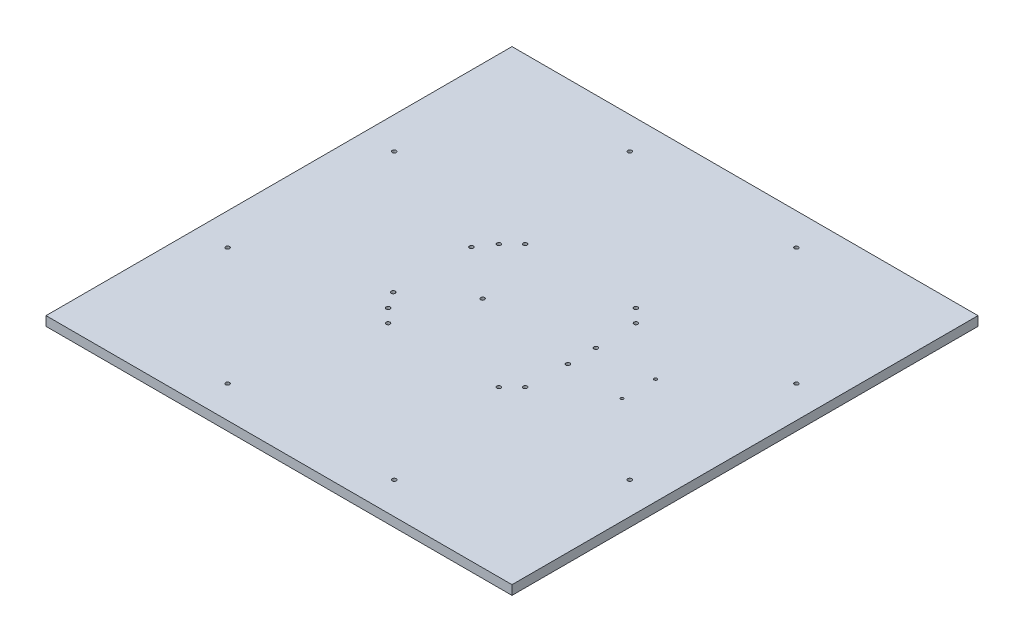
ISO-10303-21;
HEADER;
FILE_DESCRIPTION(('STEP AP214'),'2;1');
FILE_NAME('part.step','',(''),(''),'','','');
FILE_SCHEMA(('AUTOMOTIVE_DESIGN { 1 0 10303 214 1 1 1 1 }'));
ENDSEC;
DATA;
#1=APPLICATION_CONTEXT('core data for automotive mechanical design processes');
#2=APPLICATION_PROTOCOL_DEFINITION('international standard','automotive_design',2000,#1);
#3=PRODUCT_CONTEXT('',#1,'mechanical');
#4=PRODUCT('Part','Part','',(#3));
#5=PRODUCT_RELATED_PRODUCT_CATEGORY('part','',(#4));
#6=PRODUCT_DEFINITION_FORMATION('','',#4);
#7=PRODUCT_DEFINITION_CONTEXT('part definition',#1,'design');
#8=PRODUCT_DEFINITION('design','',#6,#7);
#9=PRODUCT_DEFINITION_SHAPE('','',#8);
#10=(LENGTH_UNIT() NAMED_UNIT(*) SI_UNIT(.MILLI.,.METRE.));
#11=(NAMED_UNIT(*) PLANE_ANGLE_UNIT() SI_UNIT($,.RADIAN.));
#12=(NAMED_UNIT(*) SI_UNIT($,.STERADIAN.) SOLID_ANGLE_UNIT());
#13=UNCERTAINTY_MEASURE_WITH_UNIT(LENGTH_MEASURE(1.E-05),#10,'distance_accuracy_value','');
#14=(GEOMETRIC_REPRESENTATION_CONTEXT(3) GLOBAL_UNCERTAINTY_ASSIGNED_CONTEXT((#13)) GLOBAL_UNIT_ASSIGNED_CONTEXT((#10,
#11,#12)) REPRESENTATION_CONTEXT('',''));
#15=CARTESIAN_POINT('',(0.,0.,0.));
#16=DIRECTION('',(0.,0.,1.));
#17=DIRECTION('',(1.,0.,0.));
#18=AXIS2_PLACEMENT_3D('',#15,#16,#17);
#19=CARTESIAN_POINT('',(250.,10.,-250.));
#20=DIRECTION('',(-1.,0.,0.));
#21=DIRECTION('',(0.,0.,1.));
#22=AXIS2_PLACEMENT_3D('',#19,#20,#21);
#23=PLANE('',#22);
#24=DIRECTION('',(0.,0.,-1.));
#25=VECTOR('',#24,1.);
#26=CARTESIAN_POINT('',(250.,0.,-250.));
#27=LINE('',#26,#25);
#28=CARTESIAN_POINT('',(250.,0.,250.));
#29=VERTEX_POINT('',#28);
#30=CARTESIAN_POINT('',(250.,0.,-250.));
#31=VERTEX_POINT('',#30);
#32=EDGE_CURVE('E97',#29,#31,#27,.T.);
#33=ORIENTED_EDGE('',*,*,#32,.T.);
#34=DIRECTION('',(0.,-1.,0.));
#35=VECTOR('',#34,1.);
#36=CARTESIAN_POINT('',(250.,10.,-250.));
#37=LINE('',#36,#35);
#38=CARTESIAN_POINT('',(250.,10.,-250.));
#39=VERTEX_POINT('',#38);
#40=EDGE_CURVE('E11',#39,#31,#37,.T.);
#41=ORIENTED_EDGE('',*,*,#40,.F.);
#42=DIRECTION('',(0.,0.,-1.));
#43=VECTOR('',#42,1.);
#44=CARTESIAN_POINT('',(250.,10.,-250.));
#45=LINE('',#44,#43);
#46=CARTESIAN_POINT('',(250.,10.,250.));
#47=VERTEX_POINT('',#46);
#48=EDGE_CURVE('E85',#47,#39,#45,.T.);
#49=ORIENTED_EDGE('',*,*,#48,.F.);
#50=DIRECTION('',(0.,-1.,0.));
#51=VECTOR('',#50,1.);
#52=CARTESIAN_POINT('',(250.,10.,250.));
#53=LINE('',#52,#51);
#54=EDGE_CURVE('E93',#47,#29,#53,.T.);
#55=ORIENTED_EDGE('',*,*,#54,.T.);
#56=EDGE_LOOP('',(#33,#41,#49,#55));
#57=FACE_BOUND('',#56,.T.);
#58=ADVANCED_FACE('F34',(#57),#23,.F.);
#59=CARTESIAN_POINT('',(-250.,10.,-250.));
#60=DIRECTION('',(0.,0.,1.));
#61=DIRECTION('',(1.,0.,0.));
#62=AXIS2_PLACEMENT_3D('',#59,#60,#61);
#63=PLANE('',#62);
#64=DIRECTION('',(-1.,0.,0.));
#65=VECTOR('',#64,1.);
#66=CARTESIAN_POINT('',(-250.,0.,-250.));
#67=LINE('',#66,#65);
#68=CARTESIAN_POINT('',(-250.,0.,-250.));
#69=VERTEX_POINT('',#68);
#70=EDGE_CURVE('E89',#31,#69,#67,.T.);
#71=ORIENTED_EDGE('',*,*,#70,.T.);
#72=DIRECTION('',(0.,-1.,0.));
#73=VECTOR('',#72,1.);
#74=CARTESIAN_POINT('',(-250.,10.,-250.));
#75=LINE('',#74,#73);
#76=CARTESIAN_POINT('',(-250.,10.,-250.));
#77=VERTEX_POINT('',#76);
#78=EDGE_CURVE('E42',#77,#69,#75,.T.);
#79=ORIENTED_EDGE('',*,*,#78,.F.);
#80=DIRECTION('',(-1.,0.,0.));
#81=VECTOR('',#80,1.);
#82=CARTESIAN_POINT('',(-250.,10.,-250.));
#83=LINE('',#82,#81);
#84=EDGE_CURVE('E80',#39,#77,#83,.T.);
#85=ORIENTED_EDGE('',*,*,#84,.F.);
#86=ORIENTED_EDGE('',*,*,#40,.T.);
#87=EDGE_LOOP('',(#71,#79,#85,#86));
#88=FACE_BOUND('',#87,.T.);
#89=ADVANCED_FACE('F88',(#88),#63,.F.);
#90=CARTESIAN_POINT('',(-250.,10.,-250.));
#91=DIRECTION('',(1.,0.,0.));
#92=DIRECTION('',(0.,0.,-1.));
#93=AXIS2_PLACEMENT_3D('',#90,#91,#92);
#94=PLANE('',#93);
#95=DIRECTION('',(0.,0.,1.));
#96=VECTOR('',#95,1.);
#97=CARTESIAN_POINT('',(-250.,0.,-250.));
#98=LINE('',#97,#96);
#99=CARTESIAN_POINT('',(-250.,0.,250.));
#100=VERTEX_POINT('',#99);
#101=EDGE_CURVE('E67',#69,#100,#98,.T.);
#102=ORIENTED_EDGE('',*,*,#101,.T.);
#103=DIRECTION('',(0.,-1.,0.));
#104=VECTOR('',#103,1.);
#105=CARTESIAN_POINT('',(-250.,10.,250.));
#106=LINE('',#105,#104);
#107=CARTESIAN_POINT('',(-250.,10.,250.));
#108=VERTEX_POINT('',#107);
#109=EDGE_CURVE('E90',#108,#100,#106,.T.);
#110=ORIENTED_EDGE('',*,*,#109,.F.);
#111=DIRECTION('',(0.,0.,1.));
#112=VECTOR('',#111,1.);
#113=CARTESIAN_POINT('',(-250.,10.,-250.));
#114=LINE('',#113,#112);
#115=EDGE_CURVE('E83',#77,#108,#114,.T.);
#116=ORIENTED_EDGE('',*,*,#115,.F.);
#117=ORIENTED_EDGE('',*,*,#78,.T.);
#118=EDGE_LOOP('',(#102,#110,#116,#117));
#119=FACE_BOUND('',#118,.T.);
#120=ADVANCED_FACE('F91',(#119),#94,.F.);
#121=CARTESIAN_POINT('',(-250.,10.,250.));
#122=DIRECTION('',(0.,0.,-1.));
#123=DIRECTION('',(-1.,0.,0.));
#124=AXIS2_PLACEMENT_3D('',#121,#122,#123);
#125=PLANE('',#124);
#126=DIRECTION('',(1.,0.,0.));
#127=VECTOR('',#126,1.);
#128=CARTESIAN_POINT('',(-250.,0.,250.));
#129=LINE('',#128,#127);
#130=EDGE_CURVE('E73',#100,#29,#129,.T.);
#131=ORIENTED_EDGE('',*,*,#130,.T.);
#132=ORIENTED_EDGE('',*,*,#54,.F.);
#133=DIRECTION('',(1.,0.,0.));
#134=VECTOR('',#133,1.);
#135=CARTESIAN_POINT('',(-250.,10.,250.));
#136=LINE('',#135,#134);
#137=EDGE_CURVE('E50',#108,#47,#136,.T.);
#138=ORIENTED_EDGE('',*,*,#137,.F.);
#139=ORIENTED_EDGE('',*,*,#109,.T.);
#140=EDGE_LOOP('',(#131,#132,#138,#139));
#141=FACE_BOUND('',#140,.T.);
#142=ADVANCED_FACE('F105',(#141),#125,.F.);
#143=CARTESIAN_POINT('',(0.,10.,0.));
#144=DIRECTION('',(0.,1.,0.));
#145=DIRECTION('',(0.,0.,1.));
#146=AXIS2_PLACEMENT_3D('',#143,#144,#145);
#147=PLANE('',#146);
#148=CARTESIAN_POINT('',(75.,10.,-15.));
#149=DIRECTION('',(0.,1.,0.));
#150=DIRECTION('',(0.,0.,1.));
#151=AXIS2_PLACEMENT_3D('',#148,#149,#150);
#152=CIRCLE('',#151,2.1);
#153=CARTESIAN_POINT('',(75.,10.,-12.9));
#154=VERTEX_POINT('',#153);
#155=EDGE_CURVE('E243',#154,#154,#152,.T.);
#156=ORIENTED_EDGE('',*,*,#155,.F.);
#157=EDGE_LOOP('',(#156));
#158=FACE_BOUND('',#157,.T.);
#159=CARTESIAN_POINT('',(75.,10.,15.));
#160=DIRECTION('',(0.,1.,0.));
#161=DIRECTION('',(0.,0.,1.));
#162=AXIS2_PLACEMENT_3D('',#159,#160,#161);
#163=CIRCLE('',#162,2.1);
#164=CARTESIAN_POINT('',(75.,10.,17.1));
#165=VERTEX_POINT('',#164);
#166=EDGE_CURVE('E237',#165,#165,#163,.T.);
#167=ORIENTED_EDGE('',*,*,#166,.F.);
#168=EDGE_LOOP('',(#167));
#169=FACE_BOUND('',#168,.T.);
#170=CARTESIAN_POINT('',(136.,10.,-18.));
#171=DIRECTION('',(0.,-1.,0.));
#172=DIRECTION('',(0.,0.,-1.));
#173=AXIS2_PLACEMENT_3D('',#170,#171,#172);
#174=CIRCLE('',#173,1.59999999999999);
#175=CARTESIAN_POINT('',(136.,10.,-19.6));
#176=VERTEX_POINT('',#175);
#177=EDGE_CURVE('E211',#176,#176,#174,.T.);
#178=ORIENTED_EDGE('',*,*,#177,.T.);
#179=EDGE_LOOP('',(#178));
#180=FACE_BOUND('',#179,.T.);
#181=CARTESIAN_POINT('',(136.,10.,18.));
#182=DIRECTION('',(0.,-1.,0.));
#183=DIRECTION('',(0.,0.,-1.));
#184=AXIS2_PLACEMENT_3D('',#181,#182,#183);
#185=CIRCLE('',#184,1.59999999999999);
#186=CARTESIAN_POINT('',(136.,10.,16.4));
#187=VERTEX_POINT('',#186);
#188=EDGE_CURVE('E228',#187,#187,#185,.T.);
#189=ORIENTED_EDGE('',*,*,#188,.T.);
#190=EDGE_LOOP('',(#189));
#191=FACE_BOUND('',#190,.T.);
#192=CARTESIAN_POINT('',(-85.5000000000002,10.,-42.));
#193=DIRECTION('',(0.,1.,0.));
#194=DIRECTION('',(0.,0.,1.));
#195=AXIS2_PLACEMENT_3D('',#192,#193,#194);
#196=CIRCLE('',#195,2.1);
#197=CARTESIAN_POINT('',(-85.5000000000002,10.,-39.9));
#198=VERTEX_POINT('',#197);
#199=EDGE_CURVE('E175',#198,#198,#196,.T.);
#200=ORIENTED_EDGE('',*,*,#199,.F.);
#201=EDGE_LOOP('',(#200));
#202=FACE_BOUND('',#201,.T.);
#203=CARTESIAN_POINT('',(-85.5000000000002,10.,42.));
#204=DIRECTION('',(0.,1.,0.));
#205=DIRECTION('',(0.,0.,1.));
#206=AXIS2_PLACEMENT_3D('',#203,#204,#205);
#207=CIRCLE('',#206,2.1);
#208=CARTESIAN_POINT('',(-85.5000000000002,10.,44.1));
#209=VERTEX_POINT('',#208);
#210=EDGE_CURVE('E217',#209,#209,#207,.T.);
#211=ORIENTED_EDGE('',*,*,#210,.F.);
#212=EDGE_LOOP('',(#211));
#213=FACE_BOUND('',#212,.T.);
#214=CARTESIAN_POINT('',(-31.5000000000002,10.,0.));
#215=DIRECTION('',(0.,1.,0.));
#216=DIRECTION('',(0.,0.,1.));
#217=AXIS2_PLACEMENT_3D('',#214,#215,#216);
#218=CIRCLE('',#217,2.1);
#219=CARTESIAN_POINT('',(-31.5000000000002,10.,2.10000000000001));
#220=VERTEX_POINT('',#219);
#221=EDGE_CURVE('E210',#220,#220,#218,.T.);
#222=ORIENTED_EDGE('',*,*,#221,.F.);
#223=EDGE_LOOP('',(#222));
#224=FACE_BOUND('',#223,.T.);
#225=CARTESIAN_POINT('',(-59.3969696196704,10.,-73.5391052434006));
#226=DIRECTION('',(0.,1.,0.));
#227=DIRECTION('',(1.,0.,0.));
#228=AXIS2_PLACEMENT_3D('',#225,#226,#227);
#229=CIRCLE('',#228,2.1);
#230=CARTESIAN_POINT('',(-57.2969696196704,10.,-73.5391052434006));
#231=VERTEX_POINT('',#230);
#232=EDGE_CURVE('E163',#231,#231,#229,.T.);
#233=ORIENTED_EDGE('',*,*,#232,.F.);
#234=EDGE_LOOP('',(#233));
#235=FACE_BOUND('',#234,.T.);
#236=CARTESIAN_POINT('',(-73.5391052434013,10.,-59.3969696196696));
#237=DIRECTION('',(0.,1.,0.));
#238=DIRECTION('',(1.,0.,0.));
#239=AXIS2_PLACEMENT_3D('',#236,#237,#238);
#240=CIRCLE('',#239,2.1);
#241=CARTESIAN_POINT('',(-71.4391052434013,10.,-59.3969696196696));
#242=VERTEX_POINT('',#241);
#243=EDGE_CURVE('E199',#242,#242,#240,.T.);
#244=ORIENTED_EDGE('',*,*,#243,.F.);
#245=EDGE_LOOP('',(#244));
#246=FACE_BOUND('',#245,.T.);
#247=CARTESIAN_POINT('',(-73.5391052434008,10.,59.3969696196701));
#248=DIRECTION('',(0.,1.,0.));
#249=DIRECTION('',(0.,0.,-1.));
#250=AXIS2_PLACEMENT_3D('',#247,#248,#249);
#251=CIRCLE('',#250,2.1);
#252=CARTESIAN_POINT('',(-73.5391052434008,10.,57.2969696196701));
#253=VERTEX_POINT('',#252);
#254=EDGE_CURVE('E193',#253,#253,#251,.T.);
#255=ORIENTED_EDGE('',*,*,#254,.F.);
#256=EDGE_LOOP('',(#255));
#257=FACE_BOUND('',#256,.T.);
#258=CARTESIAN_POINT('',(-59.3969696196699,10.,73.5391052434011));
#259=DIRECTION('',(0.,1.,0.));
#260=DIRECTION('',(0.,0.,-1.));
#261=AXIS2_PLACEMENT_3D('',#258,#259,#260);
#262=CIRCLE('',#261,2.1);
#263=CARTESIAN_POINT('',(-59.3969696196699,10.,71.4391052434011));
#264=VERTEX_POINT('',#263);
#265=EDGE_CURVE('E187',#264,#264,#262,.T.);
#266=ORIENTED_EDGE('',*,*,#265,.F.);
#267=EDGE_LOOP('',(#266));
#268=FACE_BOUND('',#267,.T.);
#269=CARTESIAN_POINT('',(59.3969696196709,10.,73.5391052434002));
#270=DIRECTION('',(0.,1.,0.));
#271=DIRECTION('',(-1.,0.,0.));
#272=AXIS2_PLACEMENT_3D('',#269,#270,#271);
#273=CIRCLE('',#272,2.1);
#274=CARTESIAN_POINT('',(57.2969696196709,10.,73.5391052434002));
#275=VERTEX_POINT('',#274);
#276=EDGE_CURVE('E181',#275,#275,#273,.T.);
#277=ORIENTED_EDGE('',*,*,#276,.F.);
#278=EDGE_LOOP('',(#277));
#279=FACE_BOUND('',#278,.T.);
#280=CARTESIAN_POINT('',(73.5391052434017,10.,59.3969696196691));
#281=DIRECTION('',(0.,1.,0.));
#282=DIRECTION('',(-1.,0.,0.));
#283=AXIS2_PLACEMENT_3D('',#280,#281,#282);
#284=CIRCLE('',#283,2.1);
#285=CARTESIAN_POINT('',(71.4391052434017,10.,59.3969696196691));
#286=VERTEX_POINT('',#285);
#287=EDGE_CURVE('E174',#286,#286,#284,.T.);
#288=ORIENTED_EDGE('',*,*,#287,.F.);
#289=EDGE_LOOP('',(#288));
#290=FACE_BOUND('',#289,.T.);
#291=CARTESIAN_POINT('',(73.5391052434008,10.,-59.3969696196701));
#292=DIRECTION('',(0.,1.,0.));
#293=DIRECTION('',(0.,0.,1.));
#294=AXIS2_PLACEMENT_3D('',#291,#292,#293);
#295=CIRCLE('',#294,2.1);
#296=CARTESIAN_POINT('',(73.5391052434008,10.,-57.2969696196701));
#297=VERTEX_POINT('',#296);
#298=EDGE_CURVE('E121',#297,#297,#295,.T.);
#299=ORIENTED_EDGE('',*,*,#298,.F.);
#300=EDGE_LOOP('',(#299));
#301=FACE_BOUND('',#300,.T.);
#302=CARTESIAN_POINT('',(59.3969696196699,10.,-73.5391052434011));
#303=DIRECTION('',(0.,1.,0.));
#304=DIRECTION('',(0.,0.,1.));
#305=AXIS2_PLACEMENT_3D('',#302,#303,#304);
#306=CIRCLE('',#305,2.1);
#307=CARTESIAN_POINT('',(59.3969696196699,10.,-71.4391052434011));
#308=VERTEX_POINT('',#307);
#309=EDGE_CURVE('E162',#308,#308,#306,.T.);
#310=ORIENTED_EDGE('',*,*,#309,.F.);
#311=EDGE_LOOP('',(#310));
#312=FACE_BOUND('',#311,.T.);
#313=CARTESIAN_POINT('',(-89.3565814572487,10.,-215.725870841385));
#314=DIRECTION('',(0.,1.,0.));
#315=DIRECTION('',(0.707106781186549,0.,0.707106781186546));
#316=AXIS2_PLACEMENT_3D('',#313,#314,#315);
#317=CIRCLE('',#316,2.1);
#318=CARTESIAN_POINT('',(-87.8716572167569,10.,-214.240946600894));
#319=VERTEX_POINT('',#318);
#320=EDGE_CURVE('E114',#319,#319,#317,.T.);
#321=ORIENTED_EDGE('',*,*,#320,.F.);
#322=EDGE_LOOP('',(#321));
#323=FACE_BOUND('',#322,.T.);
#324=CARTESIAN_POINT('',(-215.725870841386,10.,-89.3565814572479));
#325=DIRECTION('',(0.,1.,0.));
#326=DIRECTION('',(1.,0.,0.));
#327=AXIS2_PLACEMENT_3D('',#324,#325,#326);
#328=CIRCLE('',#327,2.1);
#329=CARTESIAN_POINT('',(-213.625870841386,10.,-89.3565814572479));
#330=VERTEX_POINT('',#329);
#331=EDGE_CURVE('E151',#330,#330,#328,.T.);
#332=ORIENTED_EDGE('',*,*,#331,.F.);
#333=EDGE_LOOP('',(#332));
#334=FACE_BOUND('',#333,.T.);
#335=CARTESIAN_POINT('',(-215.725870841385,10.,89.3565814572494));
#336=DIRECTION('',(0.,1.,0.));
#337=DIRECTION('',(0.707106781186544,0.,-0.707106781186551));
#338=AXIS2_PLACEMENT_3D('',#335,#336,#337);
#339=CIRCLE('',#338,2.1);
#340=CARTESIAN_POINT('',(-214.240946600893,10.,87.8716572167577));
#341=VERTEX_POINT('',#340);
#342=EDGE_CURVE('E145',#341,#341,#339,.T.);
#343=ORIENTED_EDGE('',*,*,#342,.F.);
#344=EDGE_LOOP('',(#343));
#345=FACE_BOUND('',#344,.T.);
#346=CARTESIAN_POINT('',(-89.3565814572487,10.,215.725870841385));
#347=DIRECTION('',(0.,1.,0.));
#348=DIRECTION('',(0.,0.,-1.));
#349=AXIS2_PLACEMENT_3D('',#346,#347,#348);
#350=CIRCLE('',#349,2.1);
#351=CARTESIAN_POINT('',(-89.3565814572487,10.,213.625870841385));
#352=VERTEX_POINT('',#351);
#353=EDGE_CURVE('E139',#352,#352,#350,.T.);
#354=ORIENTED_EDGE('',*,*,#353,.F.);
#355=EDGE_LOOP('',(#354));
#356=FACE_BOUND('',#355,.T.);
#357=CARTESIAN_POINT('',(89.3565814572502,10.,215.725870841385));
#358=DIRECTION('',(0.,1.,0.));
#359=DIRECTION('',(-0.707106781186554,0.,-0.707106781186541));
#360=AXIS2_PLACEMENT_3D('',#357,#358,#359);
#361=CIRCLE('',#360,2.1);
#362=CARTESIAN_POINT('',(87.8716572167584,10.,214.240946600893));
#363=VERTEX_POINT('',#362);
#364=EDGE_CURVE('E133',#363,#363,#361,.T.);
#365=ORIENTED_EDGE('',*,*,#364,.F.);
#366=EDGE_LOOP('',(#365));
#367=FACE_BOUND('',#366,.T.);
#368=CARTESIAN_POINT('',(215.725870841386,10.,89.3565814572464));
#369=DIRECTION('',(0.,1.,0.));
#370=DIRECTION('',(-1.,0.,0.));
#371=AXIS2_PLACEMENT_3D('',#368,#369,#370);
#372=CIRCLE('',#371,2.1);
#373=CARTESIAN_POINT('',(213.625870841386,10.,89.3565814572464));
#374=VERTEX_POINT('',#373);
#375=EDGE_CURVE('E127',#374,#374,#372,.T.);
#376=ORIENTED_EDGE('',*,*,#375,.F.);
#377=EDGE_LOOP('',(#376));
#378=FACE_BOUND('',#377,.T.);
#379=CARTESIAN_POINT('',(215.725870841384,10.,-89.3565814572509));
#380=DIRECTION('',(0.,1.,0.));
#381=DIRECTION('',(-0.707106781186539,0.,0.707106781186556));
#382=AXIS2_PLACEMENT_3D('',#379,#380,#381);
#383=CIRCLE('',#382,2.1);
#384=CARTESIAN_POINT('',(214.240946600893,10.,-87.8716572167591));
#385=VERTEX_POINT('',#384);
#386=EDGE_CURVE('E120',#385,#385,#383,.T.);
#387=ORIENTED_EDGE('',*,*,#386,.F.);
#388=EDGE_LOOP('',(#387));
#389=FACE_BOUND('',#388,.T.);
#390=CARTESIAN_POINT('',(89.3565814572487,10.,-215.725870841385));
#391=DIRECTION('',(0.,1.,0.));
#392=DIRECTION('',(0.,0.,1.));
#393=AXIS2_PLACEMENT_3D('',#390,#391,#392);
#394=CIRCLE('',#393,2.1);
#395=CARTESIAN_POINT('',(89.3565814572487,10.,-213.625870841385));
#396=VERTEX_POINT('',#395);
#397=EDGE_CURVE('E100',#396,#396,#394,.T.);
#398=ORIENTED_EDGE('',*,*,#397,.F.);
#399=EDGE_LOOP('',(#398));
#400=FACE_BOUND('',#399,.T.);
#401=ORIENTED_EDGE('',*,*,#48,.T.);
#402=ORIENTED_EDGE('',*,*,#84,.T.);
#403=ORIENTED_EDGE('',*,*,#115,.T.);
#404=ORIENTED_EDGE('',*,*,#137,.T.);
#405=EDGE_LOOP('',(#401,#402,#403,#404));
#406=FACE_BOUND('',#405,.T.);
#407=ADVANCED_FACE('F81',(#158,#169,#180,#191,#202,#213,#224,#235,#246,#257,#268,#279,#290,#301,
#312,#323,#334,#345,#356,#367,#378,#389,#400,#406),#147,.T.);
#408=CARTESIAN_POINT('',(0.,0.,0.));
#409=DIRECTION('',(0.,1.,0.));
#410=DIRECTION('',(0.,0.,1.));
#411=AXIS2_PLACEMENT_3D('',#408,#409,#410);
#412=PLANE('',#411);
#413=CARTESIAN_POINT('',(75.,0.,-15.));
#414=DIRECTION('',(0.,1.,0.));
#415=DIRECTION('',(0.,0.,1.));
#416=AXIS2_PLACEMENT_3D('',#413,#414,#415);
#417=CIRCLE('',#416,2.1);
#418=CARTESIAN_POINT('',(75.,0.,-12.9));
#419=VERTEX_POINT('',#418);
#420=EDGE_CURVE('E229',#419,#419,#417,.T.);
#421=ORIENTED_EDGE('',*,*,#420,.T.);
#422=EDGE_LOOP('',(#421));
#423=FACE_BOUND('',#422,.T.);
#424=CARTESIAN_POINT('',(75.,0.,15.));
#425=DIRECTION('',(0.,1.,0.));
#426=DIRECTION('',(0.,0.,1.));
#427=AXIS2_PLACEMENT_3D('',#424,#425,#426);
#428=CIRCLE('',#427,2.1);
#429=CARTESIAN_POINT('',(75.,0.,17.1));
#430=VERTEX_POINT('',#429);
#431=EDGE_CURVE('E240',#430,#430,#428,.T.);
#432=ORIENTED_EDGE('',*,*,#431,.T.);
#433=EDGE_LOOP('',(#432));
#434=FACE_BOUND('',#433,.T.);
#435=CARTESIAN_POINT('',(136.,0.,-18.));
#436=DIRECTION('',(0.,-1.,0.));
#437=DIRECTION('',(0.,0.,-1.));
#438=AXIS2_PLACEMENT_3D('',#435,#436,#437);
#439=CIRCLE('',#438,1.59999999999999);
#440=CARTESIAN_POINT('',(136.,0.,-19.6));
#441=VERTEX_POINT('',#440);
#442=EDGE_CURVE('E232',#441,#441,#439,.T.);
#443=ORIENTED_EDGE('',*,*,#442,.F.);
#444=EDGE_LOOP('',(#443));
#445=FACE_BOUND('',#444,.T.);
#446=CARTESIAN_POINT('',(136.,0.,18.));
#447=DIRECTION('',(0.,-1.,0.));
#448=DIRECTION('',(0.,0.,-1.));
#449=AXIS2_PLACEMENT_3D('',#446,#447,#448);
#450=CIRCLE('',#449,1.59999999999999);
#451=CARTESIAN_POINT('',(136.,0.,16.4));
#452=VERTEX_POINT('',#451);
#453=EDGE_CURVE('E225',#452,#452,#450,.T.);
#454=ORIENTED_EDGE('',*,*,#453,.F.);
#455=EDGE_LOOP('',(#454));
#456=FACE_BOUND('',#455,.T.);
#457=CARTESIAN_POINT('',(-85.5000000000002,0.,-42.));
#458=DIRECTION('',(0.,1.,0.));
#459=DIRECTION('',(0.,0.,1.));
#460=AXIS2_PLACEMENT_3D('',#457,#458,#459);
#461=CIRCLE('',#460,2.1);
#462=CARTESIAN_POINT('',(-85.5000000000002,0.,-39.9));
#463=VERTEX_POINT('',#462);
#464=EDGE_CURVE('E220',#463,#463,#461,.T.);
#465=ORIENTED_EDGE('',*,*,#464,.T.);
#466=EDGE_LOOP('',(#465));
#467=FACE_BOUND('',#466,.T.);
#468=CARTESIAN_POINT('',(-85.5000000000002,0.,42.));
#469=DIRECTION('',(0.,1.,0.));
#470=DIRECTION('',(0.,0.,1.));
#471=AXIS2_PLACEMENT_3D('',#468,#469,#470);
#472=CIRCLE('',#471,2.1);
#473=CARTESIAN_POINT('',(-85.5000000000002,0.,44.1));
#474=VERTEX_POINT('',#473);
#475=EDGE_CURVE('E214',#474,#474,#472,.T.);
#476=ORIENTED_EDGE('',*,*,#475,.T.);
#477=EDGE_LOOP('',(#476));
#478=FACE_BOUND('',#477,.T.);
#479=CARTESIAN_POINT('',(-31.5000000000002,0.,0.));
#480=DIRECTION('',(0.,1.,0.));
#481=DIRECTION('',(0.,0.,1.));
#482=AXIS2_PLACEMENT_3D('',#479,#480,#481);
#483=CIRCLE('',#482,2.1);
#484=CARTESIAN_POINT('',(-31.5000000000002,0.,2.10000000000001));
#485=VERTEX_POINT('',#484);
#486=EDGE_CURVE('E207',#485,#485,#483,.T.);
#487=ORIENTED_EDGE('',*,*,#486,.T.);
#488=EDGE_LOOP('',(#487));
#489=FACE_BOUND('',#488,.T.);
#490=CARTESIAN_POINT('',(-59.3969696196704,0.,-73.5391052434006));
#491=DIRECTION('',(0.,1.,0.));
#492=DIRECTION('',(1.,0.,0.));
#493=AXIS2_PLACEMENT_3D('',#490,#491,#492);
#494=CIRCLE('',#493,2.1);
#495=CARTESIAN_POINT('',(-57.2969696196704,0.,-73.5391052434006));
#496=VERTEX_POINT('',#495);
#497=EDGE_CURVE('E202',#496,#496,#494,.T.);
#498=ORIENTED_EDGE('',*,*,#497,.T.);
#499=EDGE_LOOP('',(#498));
#500=FACE_BOUND('',#499,.T.);
#501=CARTESIAN_POINT('',(-73.5391052434013,0.,-59.3969696196696));
#502=DIRECTION('',(0.,1.,0.));
#503=DIRECTION('',(1.,0.,0.));
#504=AXIS2_PLACEMENT_3D('',#501,#502,#503);
#505=CIRCLE('',#504,2.1);
#506=CARTESIAN_POINT('',(-71.4391052434013,0.,-59.3969696196696));
#507=VERTEX_POINT('',#506);
#508=EDGE_CURVE('E196',#507,#507,#505,.T.);
#509=ORIENTED_EDGE('',*,*,#508,.T.);
#510=EDGE_LOOP('',(#509));
#511=FACE_BOUND('',#510,.T.);
#512=CARTESIAN_POINT('',(-73.5391052434008,0.,59.3969696196701));
#513=DIRECTION('',(0.,1.,0.));
#514=DIRECTION('',(0.,0.,-1.));
#515=AXIS2_PLACEMENT_3D('',#512,#513,#514);
#516=CIRCLE('',#515,2.1);
#517=CARTESIAN_POINT('',(-73.5391052434008,0.,57.2969696196701));
#518=VERTEX_POINT('',#517);
#519=EDGE_CURVE('E190',#518,#518,#516,.T.);
#520=ORIENTED_EDGE('',*,*,#519,.T.);
#521=EDGE_LOOP('',(#520));
#522=FACE_BOUND('',#521,.T.);
#523=CARTESIAN_POINT('',(-59.3969696196699,0.,73.5391052434011));
#524=DIRECTION('',(0.,1.,0.));
#525=DIRECTION('',(0.,0.,-1.));
#526=AXIS2_PLACEMENT_3D('',#523,#524,#525);
#527=CIRCLE('',#526,2.1);
#528=CARTESIAN_POINT('',(-59.3969696196699,0.,71.4391052434011));
#529=VERTEX_POINT('',#528);
#530=EDGE_CURVE('E184',#529,#529,#527,.T.);
#531=ORIENTED_EDGE('',*,*,#530,.T.);
#532=EDGE_LOOP('',(#531));
#533=FACE_BOUND('',#532,.T.);
#534=CARTESIAN_POINT('',(59.3969696196709,0.,73.5391052434002));
#535=DIRECTION('',(0.,1.,0.));
#536=DIRECTION('',(-1.,0.,0.));
#537=AXIS2_PLACEMENT_3D('',#534,#535,#536);
#538=CIRCLE('',#537,2.1);
#539=CARTESIAN_POINT('',(57.2969696196709,0.,73.5391052434002));
#540=VERTEX_POINT('',#539);
#541=EDGE_CURVE('E178',#540,#540,#538,.T.);
#542=ORIENTED_EDGE('',*,*,#541,.T.);
#543=EDGE_LOOP('',(#542));
#544=FACE_BOUND('',#543,.T.);
#545=CARTESIAN_POINT('',(73.5391052434017,0.,59.3969696196691));
#546=DIRECTION('',(0.,1.,0.));
#547=DIRECTION('',(-1.,0.,0.));
#548=AXIS2_PLACEMENT_3D('',#545,#546,#547);
#549=CIRCLE('',#548,2.1);
#550=CARTESIAN_POINT('',(71.4391052434017,0.,59.3969696196691));
#551=VERTEX_POINT('',#550);
#552=EDGE_CURVE('E171',#551,#551,#549,.T.);
#553=ORIENTED_EDGE('',*,*,#552,.T.);
#554=EDGE_LOOP('',(#553));
#555=FACE_BOUND('',#554,.T.);
#556=CARTESIAN_POINT('',(73.5391052434008,0.,-59.3969696196701));
#557=DIRECTION('',(0.,1.,0.));
#558=DIRECTION('',(0.,0.,1.));
#559=AXIS2_PLACEMENT_3D('',#556,#557,#558);
#560=CIRCLE('',#559,2.1);
#561=CARTESIAN_POINT('',(73.5391052434008,0.,-57.2969696196701));
#562=VERTEX_POINT('',#561);
#563=EDGE_CURVE('E166',#562,#562,#560,.T.);
#564=ORIENTED_EDGE('',*,*,#563,.T.);
#565=EDGE_LOOP('',(#564));
#566=FACE_BOUND('',#565,.T.);
#567=CARTESIAN_POINT('',(59.3969696196699,0.,-73.5391052434011));
#568=DIRECTION('',(0.,1.,0.));
#569=DIRECTION('',(0.,0.,1.));
#570=AXIS2_PLACEMENT_3D('',#567,#568,#569);
#571=CIRCLE('',#570,2.1);
#572=CARTESIAN_POINT('',(59.3969696196699,0.,-71.4391052434011));
#573=VERTEX_POINT('',#572);
#574=EDGE_CURVE('E159',#573,#573,#571,.T.);
#575=ORIENTED_EDGE('',*,*,#574,.T.);
#576=EDGE_LOOP('',(#575));
#577=FACE_BOUND('',#576,.T.);
#578=CARTESIAN_POINT('',(-89.3565814572487,0.,-215.725870841385));
#579=DIRECTION('',(0.,1.,0.));
#580=DIRECTION('',(0.707106781186549,0.,0.707106781186546));
#581=AXIS2_PLACEMENT_3D('',#578,#579,#580);
#582=CIRCLE('',#581,2.1);
#583=CARTESIAN_POINT('',(-87.8716572167569,0.,-214.240946600894));
#584=VERTEX_POINT('',#583);
#585=EDGE_CURVE('E154',#584,#584,#582,.T.);
#586=ORIENTED_EDGE('',*,*,#585,.T.);
#587=EDGE_LOOP('',(#586));
#588=FACE_BOUND('',#587,.T.);
#589=CARTESIAN_POINT('',(-215.725870841386,0.,-89.3565814572479));
#590=DIRECTION('',(0.,1.,0.));
#591=DIRECTION('',(1.,0.,0.));
#592=AXIS2_PLACEMENT_3D('',#589,#590,#591);
#593=CIRCLE('',#592,2.1);
#594=CARTESIAN_POINT('',(-213.625870841386,0.,-89.3565814572479));
#595=VERTEX_POINT('',#594);
#596=EDGE_CURVE('E148',#595,#595,#593,.T.);
#597=ORIENTED_EDGE('',*,*,#596,.T.);
#598=EDGE_LOOP('',(#597));
#599=FACE_BOUND('',#598,.T.);
#600=CARTESIAN_POINT('',(-215.725870841385,0.,89.3565814572494));
#601=DIRECTION('',(0.,1.,0.));
#602=DIRECTION('',(0.707106781186544,0.,-0.707106781186551));
#603=AXIS2_PLACEMENT_3D('',#600,#601,#602);
#604=CIRCLE('',#603,2.1);
#605=CARTESIAN_POINT('',(-214.240946600893,0.,87.8716572167577));
#606=VERTEX_POINT('',#605);
#607=EDGE_CURVE('E142',#606,#606,#604,.T.);
#608=ORIENTED_EDGE('',*,*,#607,.T.);
#609=EDGE_LOOP('',(#608));
#610=FACE_BOUND('',#609,.T.);
#611=CARTESIAN_POINT('',(-89.3565814572487,0.,215.725870841385));
#612=DIRECTION('',(0.,1.,0.));
#613=DIRECTION('',(0.,0.,-1.));
#614=AXIS2_PLACEMENT_3D('',#611,#612,#613);
#615=CIRCLE('',#614,2.1);
#616=CARTESIAN_POINT('',(-89.3565814572487,0.,213.625870841385));
#617=VERTEX_POINT('',#616);
#618=EDGE_CURVE('E136',#617,#617,#615,.T.);
#619=ORIENTED_EDGE('',*,*,#618,.T.);
#620=EDGE_LOOP('',(#619));
#621=FACE_BOUND('',#620,.T.);
#622=CARTESIAN_POINT('',(89.3565814572502,0.,215.725870841385));
#623=DIRECTION('',(0.,1.,0.));
#624=DIRECTION('',(-0.707106781186554,0.,-0.707106781186541));
#625=AXIS2_PLACEMENT_3D('',#622,#623,#624);
#626=CIRCLE('',#625,2.1);
#627=CARTESIAN_POINT('',(87.8716572167584,0.,214.240946600893));
#628=VERTEX_POINT('',#627);
#629=EDGE_CURVE('E130',#628,#628,#626,.T.);
#630=ORIENTED_EDGE('',*,*,#629,.T.);
#631=EDGE_LOOP('',(#630));
#632=FACE_BOUND('',#631,.T.);
#633=CARTESIAN_POINT('',(215.725870841386,0.,89.3565814572464));
#634=DIRECTION('',(0.,1.,0.));
#635=DIRECTION('',(-1.,0.,0.));
#636=AXIS2_PLACEMENT_3D('',#633,#634,#635);
#637=CIRCLE('',#636,2.1);
#638=CARTESIAN_POINT('',(213.625870841386,0.,89.3565814572464));
#639=VERTEX_POINT('',#638);
#640=EDGE_CURVE('E124',#639,#639,#637,.T.);
#641=ORIENTED_EDGE('',*,*,#640,.T.);
#642=EDGE_LOOP('',(#641));
#643=FACE_BOUND('',#642,.T.);
#644=CARTESIAN_POINT('',(215.725870841384,0.,-89.3565814572509));
#645=DIRECTION('',(0.,1.,0.));
#646=DIRECTION('',(-0.707106781186539,0.,0.707106781186556));
#647=AXIS2_PLACEMENT_3D('',#644,#645,#646);
#648=CIRCLE('',#647,2.1);
#649=CARTESIAN_POINT('',(214.240946600893,0.,-87.8716572167591));
#650=VERTEX_POINT('',#649);
#651=EDGE_CURVE('E117',#650,#650,#648,.T.);
#652=ORIENTED_EDGE('',*,*,#651,.T.);
#653=EDGE_LOOP('',(#652));
#654=FACE_BOUND('',#653,.T.);
#655=CARTESIAN_POINT('',(89.3565814572487,0.,-215.725870841385));
#656=DIRECTION('',(0.,1.,0.));
#657=DIRECTION('',(0.,0.,1.));
#658=AXIS2_PLACEMENT_3D('',#655,#656,#657);
#659=CIRCLE('',#658,2.1);
#660=CARTESIAN_POINT('',(89.3565814572487,0.,-213.625870841385));
#661=VERTEX_POINT('',#660);
#662=EDGE_CURVE('E111',#661,#661,#659,.T.);
#663=ORIENTED_EDGE('',*,*,#662,.T.);
#664=EDGE_LOOP('',(#663));
#665=FACE_BOUND('',#664,.T.);
#666=ORIENTED_EDGE('',*,*,#32,.F.);
#667=ORIENTED_EDGE('',*,*,#130,.F.);
#668=ORIENTED_EDGE('',*,*,#101,.F.);
#669=ORIENTED_EDGE('',*,*,#70,.F.);
#670=EDGE_LOOP('',(#666,#667,#668,#669));
#671=FACE_BOUND('',#670,.T.);
#672=ADVANCED_FACE('F108',(#423,#434,#445,#456,#467,#478,#489,#500,#511,#522,#533,#544,#555,
#566,#577,#588,#599,#610,#621,#632,#643,#654,#665,#671),#412,.F.);
#673=CARTESIAN_POINT('',(89.3565814572487,10.,-215.725870841385));
#674=DIRECTION('',(0.,-1.,0.));
#675=DIRECTION('',(0.,0.,-1.));
#676=AXIS2_PLACEMENT_3D('',#673,#674,#675);
#677=CYLINDRICAL_SURFACE('',#676,2.1);
#678=ORIENTED_EDGE('',*,*,#397,.T.);
#679=EDGE_LOOP('',(#678));
#680=FACE_BOUND('',#679,.T.);
#681=ORIENTED_EDGE('',*,*,#662,.F.);
#682=EDGE_LOOP('',(#681));
#683=FACE_BOUND('',#682,.T.);
#684=ADVANCED_FACE('F305',(#680,#683),#677,.F.);
#685=CARTESIAN_POINT('',(215.725870841384,10.,-89.3565814572509));
#686=DIRECTION('',(0.,-1.,0.));
#687=DIRECTION('',(0.,0.,-1.));
#688=AXIS2_PLACEMENT_3D('',#685,#686,#687);
#689=CYLINDRICAL_SURFACE('',#688,2.1);
#690=ORIENTED_EDGE('',*,*,#386,.T.);
#691=EDGE_LOOP('',(#690));
#692=FACE_BOUND('',#691,.T.);
#693=ORIENTED_EDGE('',*,*,#651,.F.);
#694=EDGE_LOOP('',(#693));
#695=FACE_BOUND('',#694,.T.);
#696=ADVANCED_FACE('F308',(#692,#695),#689,.F.);
#697=CARTESIAN_POINT('',(215.725870841386,10.,89.3565814572464));
#698=DIRECTION('',(0.,-1.,0.));
#699=DIRECTION('',(0.,0.,-1.));
#700=AXIS2_PLACEMENT_3D('',#697,#698,#699);
#701=CYLINDRICAL_SURFACE('',#700,2.1);
#702=ORIENTED_EDGE('',*,*,#375,.T.);
#703=EDGE_LOOP('',(#702));
#704=FACE_BOUND('',#703,.T.);
#705=ORIENTED_EDGE('',*,*,#640,.F.);
#706=EDGE_LOOP('',(#705));
#707=FACE_BOUND('',#706,.T.);
#708=ADVANCED_FACE('F352',(#704,#707),#701,.F.);
#709=CARTESIAN_POINT('',(89.3565814572502,10.,215.725870841385));
#710=DIRECTION('',(0.,-1.,0.));
#711=DIRECTION('',(0.,0.,-1.));
#712=AXIS2_PLACEMENT_3D('',#709,#710,#711);
#713=CYLINDRICAL_SURFACE('',#712,2.1);
#714=ORIENTED_EDGE('',*,*,#364,.T.);
#715=EDGE_LOOP('',(#714));
#716=FACE_BOUND('',#715,.T.);
#717=ORIENTED_EDGE('',*,*,#629,.F.);
#718=EDGE_LOOP('',(#717));
#719=FACE_BOUND('',#718,.T.);
#720=ADVANCED_FACE('F360',(#716,#719),#713,.F.);
#721=CARTESIAN_POINT('',(-89.3565814572487,10.,215.725870841385));
#722=DIRECTION('',(0.,-1.,0.));
#723=DIRECTION('',(0.,0.,-1.));
#724=AXIS2_PLACEMENT_3D('',#721,#722,#723);
#725=CYLINDRICAL_SURFACE('',#724,2.1);
#726=ORIENTED_EDGE('',*,*,#353,.T.);
#727=EDGE_LOOP('',(#726));
#728=FACE_BOUND('',#727,.T.);
#729=ORIENTED_EDGE('',*,*,#618,.F.);
#730=EDGE_LOOP('',(#729));
#731=FACE_BOUND('',#730,.T.);
#732=ADVANCED_FACE('F368',(#728,#731),#725,.F.);
#733=CARTESIAN_POINT('',(-215.725870841385,10.,89.3565814572494));
#734=DIRECTION('',(0.,-1.,0.));
#735=DIRECTION('',(0.,0.,-1.));
#736=AXIS2_PLACEMENT_3D('',#733,#734,#735);
#737=CYLINDRICAL_SURFACE('',#736,2.1);
#738=ORIENTED_EDGE('',*,*,#342,.T.);
#739=EDGE_LOOP('',(#738));
#740=FACE_BOUND('',#739,.T.);
#741=ORIENTED_EDGE('',*,*,#607,.F.);
#742=EDGE_LOOP('',(#741));
#743=FACE_BOUND('',#742,.T.);
#744=ADVANCED_FACE('F376',(#740,#743),#737,.F.);
#745=CARTESIAN_POINT('',(-215.725870841386,10.,-89.3565814572479));
#746=DIRECTION('',(0.,-1.,0.));
#747=DIRECTION('',(0.,0.,-1.));
#748=AXIS2_PLACEMENT_3D('',#745,#746,#747);
#749=CYLINDRICAL_SURFACE('',#748,2.1);
#750=ORIENTED_EDGE('',*,*,#331,.T.);
#751=EDGE_LOOP('',(#750));
#752=FACE_BOUND('',#751,.T.);
#753=ORIENTED_EDGE('',*,*,#596,.F.);
#754=EDGE_LOOP('',(#753));
#755=FACE_BOUND('',#754,.T.);
#756=ADVANCED_FACE('F384',(#752,#755),#749,.F.);
#757=CARTESIAN_POINT('',(-89.3565814572487,10.,-215.725870841385));
#758=DIRECTION('',(0.,-1.,0.));
#759=DIRECTION('',(0.,0.,-1.));
#760=AXIS2_PLACEMENT_3D('',#757,#758,#759);
#761=CYLINDRICAL_SURFACE('',#760,2.1);
#762=ORIENTED_EDGE('',*,*,#320,.T.);
#763=EDGE_LOOP('',(#762));
#764=FACE_BOUND('',#763,.T.);
#765=ORIENTED_EDGE('',*,*,#585,.F.);
#766=EDGE_LOOP('',(#765));
#767=FACE_BOUND('',#766,.T.);
#768=ADVANCED_FACE('F392',(#764,#767),#761,.F.);
#769=CARTESIAN_POINT('',(59.3969696196699,10.,-73.5391052434011));
#770=DIRECTION('',(0.,-1.,0.));
#771=DIRECTION('',(0.,0.,-1.));
#772=AXIS2_PLACEMENT_3D('',#769,#770,#771);
#773=CYLINDRICAL_SURFACE('',#772,2.1);
#774=ORIENTED_EDGE('',*,*,#309,.T.);
#775=EDGE_LOOP('',(#774));
#776=FACE_BOUND('',#775,.T.);
#777=ORIENTED_EDGE('',*,*,#574,.F.);
#778=EDGE_LOOP('',(#777));
#779=FACE_BOUND('',#778,.T.);
#780=ADVANCED_FACE('F400',(#776,#779),#773,.F.);
#781=CARTESIAN_POINT('',(73.5391052434008,10.,-59.3969696196701));
#782=DIRECTION('',(0.,-1.,0.));
#783=DIRECTION('',(0.,0.,-1.));
#784=AXIS2_PLACEMENT_3D('',#781,#782,#783);
#785=CYLINDRICAL_SURFACE('',#784,2.1);
#786=ORIENTED_EDGE('',*,*,#298,.T.);
#787=EDGE_LOOP('',(#786));
#788=FACE_BOUND('',#787,.T.);
#789=ORIENTED_EDGE('',*,*,#563,.F.);
#790=EDGE_LOOP('',(#789));
#791=FACE_BOUND('',#790,.T.);
#792=ADVANCED_FACE('F408',(#788,#791),#785,.F.);
#793=CARTESIAN_POINT('',(73.5391052434017,10.,59.3969696196691));
#794=DIRECTION('',(0.,-1.,0.));
#795=DIRECTION('',(0.,0.,-1.));
#796=AXIS2_PLACEMENT_3D('',#793,#794,#795);
#797=CYLINDRICAL_SURFACE('',#796,2.1);
#798=ORIENTED_EDGE('',*,*,#287,.T.);
#799=EDGE_LOOP('',(#798));
#800=FACE_BOUND('',#799,.T.);
#801=ORIENTED_EDGE('',*,*,#552,.F.);
#802=EDGE_LOOP('',(#801));
#803=FACE_BOUND('',#802,.T.);
#804=ADVANCED_FACE('F416',(#800,#803),#797,.F.);
#805=CARTESIAN_POINT('',(59.3969696196709,10.,73.5391052434002));
#806=DIRECTION('',(0.,-1.,0.));
#807=DIRECTION('',(0.,0.,-1.));
#808=AXIS2_PLACEMENT_3D('',#805,#806,#807);
#809=CYLINDRICAL_SURFACE('',#808,2.1);
#810=ORIENTED_EDGE('',*,*,#276,.T.);
#811=EDGE_LOOP('',(#810));
#812=FACE_BOUND('',#811,.T.);
#813=ORIENTED_EDGE('',*,*,#541,.F.);
#814=EDGE_LOOP('',(#813));
#815=FACE_BOUND('',#814,.T.);
#816=ADVANCED_FACE('F424',(#812,#815),#809,.F.);
#817=CARTESIAN_POINT('',(-59.3969696196699,10.,73.5391052434011));
#818=DIRECTION('',(0.,-1.,0.));
#819=DIRECTION('',(0.,0.,-1.));
#820=AXIS2_PLACEMENT_3D('',#817,#818,#819);
#821=CYLINDRICAL_SURFACE('',#820,2.1);
#822=ORIENTED_EDGE('',*,*,#265,.T.);
#823=EDGE_LOOP('',(#822));
#824=FACE_BOUND('',#823,.T.);
#825=ORIENTED_EDGE('',*,*,#530,.F.);
#826=EDGE_LOOP('',(#825));
#827=FACE_BOUND('',#826,.T.);
#828=ADVANCED_FACE('F432',(#824,#827),#821,.F.);
#829=CARTESIAN_POINT('',(-73.5391052434008,10.,59.3969696196701));
#830=DIRECTION('',(0.,-1.,0.));
#831=DIRECTION('',(0.,0.,-1.));
#832=AXIS2_PLACEMENT_3D('',#829,#830,#831);
#833=CYLINDRICAL_SURFACE('',#832,2.1);
#834=ORIENTED_EDGE('',*,*,#254,.T.);
#835=EDGE_LOOP('',(#834));
#836=FACE_BOUND('',#835,.T.);
#837=ORIENTED_EDGE('',*,*,#519,.F.);
#838=EDGE_LOOP('',(#837));
#839=FACE_BOUND('',#838,.T.);
#840=ADVANCED_FACE('F440',(#836,#839),#833,.F.);
#841=CARTESIAN_POINT('',(-73.5391052434013,10.,-59.3969696196696));
#842=DIRECTION('',(0.,-1.,0.));
#843=DIRECTION('',(0.,0.,-1.));
#844=AXIS2_PLACEMENT_3D('',#841,#842,#843);
#845=CYLINDRICAL_SURFACE('',#844,2.1);
#846=ORIENTED_EDGE('',*,*,#243,.T.);
#847=EDGE_LOOP('',(#846));
#848=FACE_BOUND('',#847,.T.);
#849=ORIENTED_EDGE('',*,*,#508,.F.);
#850=EDGE_LOOP('',(#849));
#851=FACE_BOUND('',#850,.T.);
#852=ADVANCED_FACE('F448',(#848,#851),#845,.F.);
#853=CARTESIAN_POINT('',(-59.3969696196704,10.,-73.5391052434006));
#854=DIRECTION('',(0.,-1.,0.));
#855=DIRECTION('',(0.,0.,-1.));
#856=AXIS2_PLACEMENT_3D('',#853,#854,#855);
#857=CYLINDRICAL_SURFACE('',#856,2.1);
#858=ORIENTED_EDGE('',*,*,#232,.T.);
#859=EDGE_LOOP('',(#858));
#860=FACE_BOUND('',#859,.T.);
#861=ORIENTED_EDGE('',*,*,#497,.F.);
#862=EDGE_LOOP('',(#861));
#863=FACE_BOUND('',#862,.T.);
#864=ADVANCED_FACE('F456',(#860,#863),#857,.F.);
#865=CARTESIAN_POINT('',(-31.5000000000002,10.,0.));
#866=DIRECTION('',(0.,-1.,0.));
#867=DIRECTION('',(0.,0.,-1.));
#868=AXIS2_PLACEMENT_3D('',#865,#866,#867);
#869=CYLINDRICAL_SURFACE('',#868,2.1);
#870=ORIENTED_EDGE('',*,*,#221,.T.);
#871=EDGE_LOOP('',(#870));
#872=FACE_BOUND('',#871,.T.);
#873=ORIENTED_EDGE('',*,*,#486,.F.);
#874=EDGE_LOOP('',(#873));
#875=FACE_BOUND('',#874,.T.);
#876=ADVANCED_FACE('F464',(#872,#875),#869,.F.);
#877=CARTESIAN_POINT('',(-85.5000000000002,10.,42.));
#878=DIRECTION('',(0.,-1.,0.));
#879=DIRECTION('',(0.,0.,-1.));
#880=AXIS2_PLACEMENT_3D('',#877,#878,#879);
#881=CYLINDRICAL_SURFACE('',#880,2.1);
#882=ORIENTED_EDGE('',*,*,#210,.T.);
#883=EDGE_LOOP('',(#882));
#884=FACE_BOUND('',#883,.T.);
#885=ORIENTED_EDGE('',*,*,#475,.F.);
#886=EDGE_LOOP('',(#885));
#887=FACE_BOUND('',#886,.T.);
#888=ADVANCED_FACE('F472',(#884,#887),#881,.F.);
#889=CARTESIAN_POINT('',(-85.5000000000002,10.,-42.));
#890=DIRECTION('',(0.,-1.,0.));
#891=DIRECTION('',(0.,0.,-1.));
#892=AXIS2_PLACEMENT_3D('',#889,#890,#891);
#893=CYLINDRICAL_SURFACE('',#892,2.1);
#894=ORIENTED_EDGE('',*,*,#199,.T.);
#895=EDGE_LOOP('',(#894));
#896=FACE_BOUND('',#895,.T.);
#897=ORIENTED_EDGE('',*,*,#464,.F.);
#898=EDGE_LOOP('',(#897));
#899=FACE_BOUND('',#898,.T.);
#900=ADVANCED_FACE('F480',(#896,#899),#893,.F.);
#901=CARTESIAN_POINT('',(136.,10.,18.));
#902=DIRECTION('',(0.,-1.,0.));
#903=DIRECTION('',(0.,0.,-1.));
#904=AXIS2_PLACEMENT_3D('',#901,#902,#903);
#905=CYLINDRICAL_SURFACE('',#904,1.59999999999999);
#906=ORIENTED_EDGE('',*,*,#188,.F.);
#907=EDGE_LOOP('',(#906));
#908=FACE_BOUND('',#907,.T.);
#909=ORIENTED_EDGE('',*,*,#453,.T.);
#910=EDGE_LOOP('',(#909));
#911=FACE_BOUND('',#910,.T.);
#912=ADVANCED_FACE('F488',(#908,#911),#905,.F.);
#913=CARTESIAN_POINT('',(136.,10.,-18.));
#914=DIRECTION('',(0.,-1.,0.));
#915=DIRECTION('',(0.,0.,-1.));
#916=AXIS2_PLACEMENT_3D('',#913,#914,#915);
#917=CYLINDRICAL_SURFACE('',#916,1.59999999999999);
#918=ORIENTED_EDGE('',*,*,#177,.F.);
#919=EDGE_LOOP('',(#918));
#920=FACE_BOUND('',#919,.T.);
#921=ORIENTED_EDGE('',*,*,#442,.T.);
#922=EDGE_LOOP('',(#921));
#923=FACE_BOUND('',#922,.T.);
#924=ADVANCED_FACE('F496',(#920,#923),#917,.F.);
#925=CARTESIAN_POINT('',(75.,0.,15.));
#926=DIRECTION('',(0.,1.,0.));
#927=DIRECTION('',(0.,0.,1.));
#928=AXIS2_PLACEMENT_3D('',#925,#926,#927);
#929=CYLINDRICAL_SURFACE('',#928,2.1);
#930=ORIENTED_EDGE('',*,*,#431,.F.);
#931=EDGE_LOOP('',(#930));
#932=FACE_BOUND('',#931,.T.);
#933=ORIENTED_EDGE('',*,*,#166,.T.);
#934=EDGE_LOOP('',(#933));
#935=FACE_BOUND('',#934,.T.);
#936=ADVANCED_FACE('F254',(#932,#935),#929,.F.);
#937=CARTESIAN_POINT('',(75.,0.,-15.));
#938=DIRECTION('',(0.,1.,0.));
#939=DIRECTION('',(0.,0.,1.));
#940=AXIS2_PLACEMENT_3D('',#937,#938,#939);
#941=CYLINDRICAL_SURFACE('',#940,2.1);
#942=ORIENTED_EDGE('',*,*,#420,.F.);
#943=EDGE_LOOP('',(#942));
#944=FACE_BOUND('',#943,.T.);
#945=ORIENTED_EDGE('',*,*,#155,.T.);
#946=EDGE_LOOP('',(#945));
#947=FACE_BOUND('',#946,.T.);
#948=ADVANCED_FACE('F251',(#944,#947),#941,.F.);
#949=CLOSED_SHELL('',(#58,#89,#120,#142,#407,#672,#684,#696,#708,#720,#732,#744,#756,#768,#780,
#792,#804,#816,#828,#840,#852,#864,#876,#888,#900,#912,#924,#936,#948));
#950=MANIFOLD_SOLID_BREP('B2',#949);
#951=ADVANCED_BREP_SHAPE_REPRESENTATION('',(#18,#950),#14);
#952=SHAPE_DEFINITION_REPRESENTATION(#9,#951);
ENDSEC;
END-ISO-10303-21;
